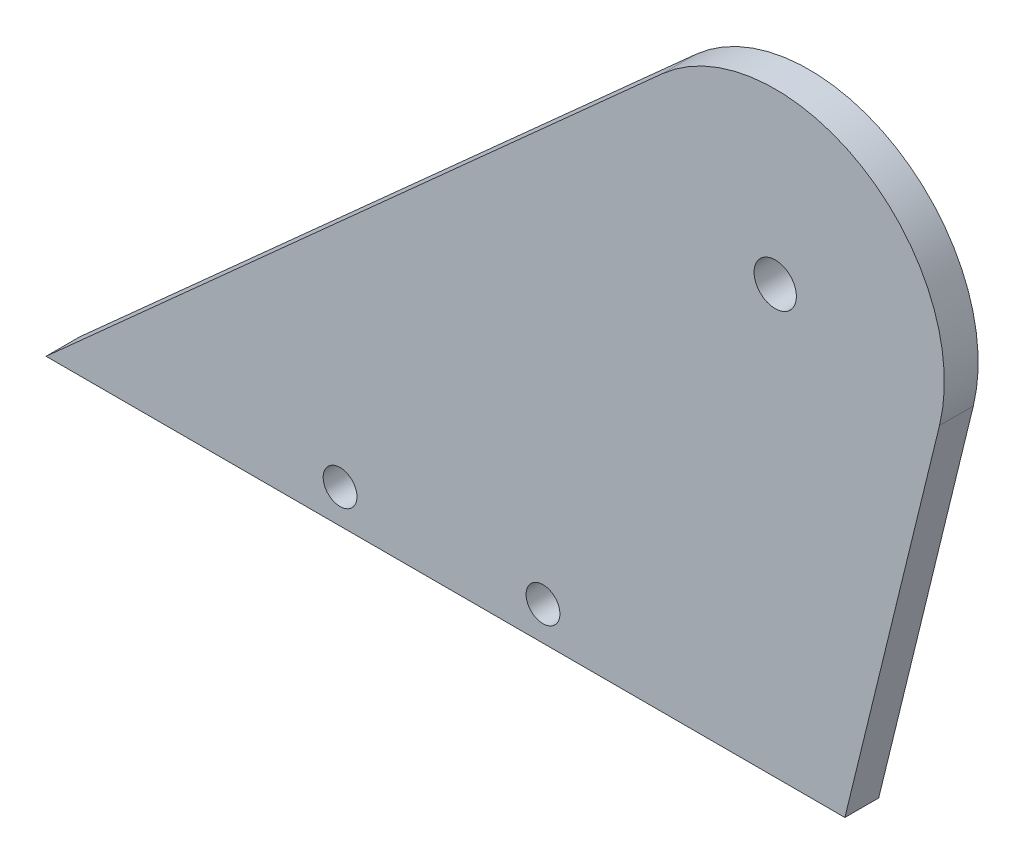
ISO-10303-21;
HEADER;
FILE_DESCRIPTION(('STEP AP214'),'2;1');
FILE_NAME('part.step','',(''),(''),'','','');
FILE_SCHEMA(('AUTOMOTIVE_DESIGN { 1 0 10303 214 1 1 1 1 }'));
ENDSEC;
DATA;
#1=APPLICATION_CONTEXT('core data for automotive mechanical design processes');
#2=APPLICATION_PROTOCOL_DEFINITION('international standard','automotive_design',2000,#1);
#3=PRODUCT_CONTEXT('',#1,'mechanical');
#4=PRODUCT('Part','Part','',(#3));
#5=PRODUCT_RELATED_PRODUCT_CATEGORY('part','',(#4));
#6=PRODUCT_DEFINITION_FORMATION('','',#4);
#7=PRODUCT_DEFINITION_CONTEXT('part definition',#1,'design');
#8=PRODUCT_DEFINITION('design','',#6,#7);
#9=PRODUCT_DEFINITION_SHAPE('','',#8);
#10=(LENGTH_UNIT() NAMED_UNIT(*) SI_UNIT(.MILLI.,.METRE.));
#11=(NAMED_UNIT(*) PLANE_ANGLE_UNIT() SI_UNIT($,.RADIAN.));
#12=(NAMED_UNIT(*) SI_UNIT($,.STERADIAN.) SOLID_ANGLE_UNIT());
#13=UNCERTAINTY_MEASURE_WITH_UNIT(LENGTH_MEASURE(1.E-05),#10,'distance_accuracy_value','');
#14=(GEOMETRIC_REPRESENTATION_CONTEXT(3) GLOBAL_UNCERTAINTY_ASSIGNED_CONTEXT((#13)) GLOBAL_UNIT_ASSIGNED_CONTEXT((#10,
#11,#12)) REPRESENTATION_CONTEXT('',''));
#15=CARTESIAN_POINT('',(0.,0.,0.));
#16=DIRECTION('',(0.,0.,1.));
#17=DIRECTION('',(1.,0.,0.));
#18=AXIS2_PLACEMENT_3D('',#15,#16,#17);
#19=CARTESIAN_POINT('',(0.,0.,2.));
#20=DIRECTION('',(0.,0.,1.));
#21=DIRECTION('',(1.,0.,0.));
#22=AXIS2_PLACEMENT_3D('',#19,#20,#21);
#23=PLANE('',#22);
#24=CARTESIAN_POINT('',(-25.7326094491656,-23.246867961275,2.));
#25=DIRECTION('',(0.,0.,1.));
#26=DIRECTION('',(1.,0.,0.));
#27=AXIS2_PLACEMENT_3D('',#24,#25,#26);
#28=CIRCLE('',#27,1.);
#29=CARTESIAN_POINT('',(-24.7326094491656,-23.246867961275,2.));
#30=VERTEX_POINT('',#29);
#31=EDGE_CURVE('E114',#30,#30,#28,.T.);
#32=ORIENTED_EDGE('',*,*,#31,.F.);
#33=EDGE_LOOP('',(#32));
#34=FACE_BOUND('',#33,.T.);
#35=CARTESIAN_POINT('',(0.,0.,2.));
#36=DIRECTION('',(0.,0.,1.));
#37=DIRECTION('',(1.,0.,0.));
#38=AXIS2_PLACEMENT_3D('',#35,#36,#37);
#39=CIRCLE('',#38,10.);
#40=CARTESIAN_POINT('',(9.71355394965933,-2.37631430308738,2.));
#41=VERTEX_POINT('',#40);
#42=CARTESIAN_POINT('',(-6.67743112180892,7.44391789405939,2.));
#43=VERTEX_POINT('',#42);
#44=EDGE_CURVE('E83',#41,#43,#39,.T.);
#45=ORIENTED_EDGE('',*,*,#44,.T.);
#46=DIRECTION('',(-0.744391789405939,-0.667743112180893,0.));
#47=VECTOR('',#46,1.);
#48=CARTESIAN_POINT('',(-43.1207161756372,-25.246867961275,2.));
#49=LINE('',#48,#47);
#50=CARTESIAN_POINT('',(-43.1207161756372,-25.246867961275,2.));
#51=VERTEX_POINT('',#50);
#52=EDGE_CURVE('E78',#43,#51,#49,.T.);
#53=ORIENTED_EDGE('',*,*,#52,.T.);
#54=DIRECTION('',(1.,0.,0.));
#55=VECTOR('',#54,1.);
#56=CARTESIAN_POINT('',(-43.1207161756372,-25.246867961275,2.));
#57=LINE('',#56,#55);
#58=CARTESIAN_POINT('',(4.11852415323917,-25.246867961275,2.));
#59=VERTEX_POINT('',#58);
#60=EDGE_CURVE('E81',#51,#59,#57,.T.);
#61=ORIENTED_EDGE('',*,*,#60,.T.);
#62=DIRECTION('',(0.237631430308738,0.971355394965933,0.));
#63=VECTOR('',#62,1.);
#64=CARTESIAN_POINT('',(4.11852415323917,-25.246867961275,2.));
#65=LINE('',#64,#63);
#66=EDGE_CURVE('E49',#59,#41,#65,.T.);
#67=ORIENTED_EDGE('',*,*,#66,.T.);
#68=EDGE_LOOP('',(#45,#53,#61,#67));
#69=FACE_BOUND('',#68,.T.);
#70=CARTESIAN_POINT('',(0.,0.,2.));
#71=DIRECTION('',(0.,0.,1.));
#72=DIRECTION('',(1.,0.,0.));
#73=AXIS2_PLACEMENT_3D('',#70,#71,#72);
#74=CIRCLE('',#73,1.25);
#75=CARTESIAN_POINT('',(1.25,0.,2.));
#76=VERTEX_POINT('',#75);
#77=EDGE_CURVE('E99',#76,#76,#74,.T.);
#78=ORIENTED_EDGE('',*,*,#77,.F.);
#79=EDGE_LOOP('',(#78));
#80=FACE_BOUND('',#79,.T.);
#81=CARTESIAN_POINT('',(-13.7326094491656,-23.246867961275,2.));
#82=DIRECTION('',(0.,0.,1.));
#83=DIRECTION('',(1.,0.,0.));
#84=AXIS2_PLACEMENT_3D('',#81,#82,#83);
#85=CIRCLE('',#84,1.);
#86=CARTESIAN_POINT('',(-12.7326094491656,-23.246867961275,2.));
#87=VERTEX_POINT('',#86);
#88=EDGE_CURVE('E120',#87,#87,#85,.T.);
#89=ORIENTED_EDGE('',*,*,#88,.F.);
#90=EDGE_LOOP('',(#89));
#91=FACE_BOUND('',#90,.T.);
#92=ADVANCED_FACE('F32',(#34,#69,#80,#91),#23,.T.);
#93=CARTESIAN_POINT('',(0.,0.,0.));
#94=DIRECTION('',(0.,0.,1.));
#95=DIRECTION('',(1.,0.,0.));
#96=AXIS2_PLACEMENT_3D('',#93,#94,#95);
#97=PLANE('',#96);
#98=CARTESIAN_POINT('',(0.,0.,0.));
#99=DIRECTION('',(0.,0.,1.));
#100=DIRECTION('',(1.,0.,0.));
#101=AXIS2_PLACEMENT_3D('',#98,#99,#100);
#102=CIRCLE('',#101,10.);
#103=CARTESIAN_POINT('',(9.71355394965933,-2.37631430308738,0.));
#104=VERTEX_POINT('',#103);
#105=CARTESIAN_POINT('',(-6.67743112180892,7.44391789405939,0.));
#106=VERTEX_POINT('',#105);
#107=EDGE_CURVE('E96',#104,#106,#102,.T.);
#108=ORIENTED_EDGE('',*,*,#107,.F.);
#109=DIRECTION('',(0.237631430308738,0.971355394965933,0.));
#110=VECTOR('',#109,1.);
#111=CARTESIAN_POINT('',(4.11852415323917,-25.246867961275,0.));
#112=LINE('',#111,#110);
#113=CARTESIAN_POINT('',(4.11852415323917,-25.246867961275,0.));
#114=VERTEX_POINT('',#113);
#115=EDGE_CURVE('E71',#114,#104,#112,.T.);
#116=ORIENTED_EDGE('',*,*,#115,.F.);
#117=DIRECTION('',(1.,0.,0.));
#118=VECTOR('',#117,1.);
#119=CARTESIAN_POINT('',(4.11852415323917,-25.246867961275,0.));
#120=LINE('',#119,#118);
#121=CARTESIAN_POINT('',(-43.1207161756372,-25.246867961275,0.));
#122=VERTEX_POINT('',#121);
#123=EDGE_CURVE('E65',#122,#114,#120,.T.);
#124=ORIENTED_EDGE('',*,*,#123,.F.);
#125=DIRECTION('',(-0.744391789405939,-0.667743112180893,0.));
#126=VECTOR('',#125,1.);
#127=CARTESIAN_POINT('',(-43.1207161756372,-25.246867961275,0.));
#128=LINE('',#127,#126);
#129=EDGE_CURVE('E88',#106,#122,#128,.T.);
#130=ORIENTED_EDGE('',*,*,#129,.F.);
#131=EDGE_LOOP('',(#108,#116,#124,#130));
#132=FACE_BOUND('',#131,.T.);
#133=CARTESIAN_POINT('',(0.,0.,0.));
#134=DIRECTION('',(0.,0.,1.));
#135=DIRECTION('',(1.,0.,0.));
#136=AXIS2_PLACEMENT_3D('',#133,#134,#135);
#137=CIRCLE('',#136,1.25);
#138=CARTESIAN_POINT('',(1.25,0.,0.));
#139=VERTEX_POINT('',#138);
#140=EDGE_CURVE('E111',#139,#139,#137,.T.);
#141=ORIENTED_EDGE('',*,*,#140,.T.);
#142=EDGE_LOOP('',(#141));
#143=FACE_BOUND('',#142,.T.);
#144=CARTESIAN_POINT('',(-25.7326094491656,-23.246867961275,0.));
#145=DIRECTION('',(0.,0.,1.));
#146=DIRECTION('',(1.,0.,0.));
#147=AXIS2_PLACEMENT_3D('',#144,#145,#146);
#148=CIRCLE('',#147,1.);
#149=CARTESIAN_POINT('',(-24.7326094491656,-23.246867961275,0.));
#150=VERTEX_POINT('',#149);
#151=EDGE_CURVE('E117',#150,#150,#148,.T.);
#152=ORIENTED_EDGE('',*,*,#151,.T.);
#153=EDGE_LOOP('',(#152));
#154=FACE_BOUND('',#153,.T.);
#155=CARTESIAN_POINT('',(-13.7326094491656,-23.246867961275,0.));
#156=DIRECTION('',(0.,0.,1.));
#157=DIRECTION('',(1.,0.,0.));
#158=AXIS2_PLACEMENT_3D('',#155,#156,#157);
#159=CIRCLE('',#158,1.);
#160=CARTESIAN_POINT('',(-12.7326094491656,-23.246867961275,0.));
#161=VERTEX_POINT('',#160);
#162=EDGE_CURVE('E123',#161,#161,#159,.T.);
#163=ORIENTED_EDGE('',*,*,#162,.T.);
#164=EDGE_LOOP('',(#163));
#165=FACE_BOUND('',#164,.T.);
#166=ADVANCED_FACE('F107',(#132,#143,#154,#165),#97,.F.);
#167=CARTESIAN_POINT('',(0.,0.,2.));
#168=DIRECTION('',(0.,0.,-1.));
#169=DIRECTION('',(-1.,0.,0.));
#170=AXIS2_PLACEMENT_3D('',#167,#168,#169);
#171=CYLINDRICAL_SURFACE('',#170,10.);
#172=ORIENTED_EDGE('',*,*,#107,.T.);
#173=DIRECTION('',(0.,0.,-1.));
#174=VECTOR('',#173,1.);
#175=CARTESIAN_POINT('',(-6.67743112180892,7.44391789405939,2.));
#176=LINE('',#175,#174);
#177=EDGE_CURVE('E11',#43,#106,#176,.T.);
#178=ORIENTED_EDGE('',*,*,#177,.F.);
#179=ORIENTED_EDGE('',*,*,#44,.F.);
#180=DIRECTION('',(0.,0.,-1.));
#181=VECTOR('',#180,1.);
#182=CARTESIAN_POINT('',(9.71355394965933,-2.37631430308738,2.));
#183=LINE('',#182,#181);
#184=EDGE_CURVE('E92',#41,#104,#183,.T.);
#185=ORIENTED_EDGE('',*,*,#184,.T.);
#186=EDGE_LOOP('',(#172,#178,#179,#185));
#187=FACE_BOUND('',#186,.T.);
#188=ADVANCED_FACE('F34',(#187),#171,.T.);
#189=CARTESIAN_POINT('',(-43.1207161756372,-25.246867961275,2.));
#190=DIRECTION('',(0.667743112180893,-0.744391789405939,0.));
#191=DIRECTION('',(0.744391789405939,0.667743112180893,0.));
#192=AXIS2_PLACEMENT_3D('',#189,#190,#191);
#193=PLANE('',#192);
#194=ORIENTED_EDGE('',*,*,#129,.T.);
#195=DIRECTION('',(0.,0.,-1.));
#196=VECTOR('',#195,1.);
#197=CARTESIAN_POINT('',(-43.1207161756372,-25.246867961275,2.));
#198=LINE('',#197,#196);
#199=EDGE_CURVE('E41',#51,#122,#198,.T.);
#200=ORIENTED_EDGE('',*,*,#199,.F.);
#201=ORIENTED_EDGE('',*,*,#52,.F.);
#202=ORIENTED_EDGE('',*,*,#177,.T.);
#203=EDGE_LOOP('',(#194,#200,#201,#202));
#204=FACE_BOUND('',#203,.T.);
#205=ADVANCED_FACE('F87',(#204),#193,.F.);
#206=CARTESIAN_POINT('',(4.11852415323917,-25.246867961275,2.));
#207=DIRECTION('',(0.,1.,0.));
#208=DIRECTION('',(0.,0.,1.));
#209=AXIS2_PLACEMENT_3D('',#206,#207,#208);
#210=PLANE('',#209);
#211=ORIENTED_EDGE('',*,*,#123,.T.);
#212=DIRECTION('',(0.,0.,-1.));
#213=VECTOR('',#212,1.);
#214=CARTESIAN_POINT('',(4.11852415323917,-25.246867961275,2.));
#215=LINE('',#214,#213);
#216=EDGE_CURVE('E89',#59,#114,#215,.T.);
#217=ORIENTED_EDGE('',*,*,#216,.F.);
#218=ORIENTED_EDGE('',*,*,#60,.F.);
#219=ORIENTED_EDGE('',*,*,#199,.T.);
#220=EDGE_LOOP('',(#211,#217,#218,#219));
#221=FACE_BOUND('',#220,.T.);
#222=ADVANCED_FACE('F90',(#221),#210,.F.);
#223=CARTESIAN_POINT('',(4.11852415323917,-25.246867961275,2.));
#224=DIRECTION('',(-0.971355394965933,0.237631430308738,0.));
#225=DIRECTION('',(-0.237631430308738,-0.971355394965933,0.));
#226=AXIS2_PLACEMENT_3D('',#223,#224,#225);
#227=PLANE('',#226);
#228=ORIENTED_EDGE('',*,*,#115,.T.);
#229=ORIENTED_EDGE('',*,*,#184,.F.);
#230=ORIENTED_EDGE('',*,*,#66,.F.);
#231=ORIENTED_EDGE('',*,*,#216,.T.);
#232=EDGE_LOOP('',(#228,#229,#230,#231));
#233=FACE_BOUND('',#232,.T.);
#234=ADVANCED_FACE('F104',(#233),#227,.F.);
#235=CARTESIAN_POINT('',(0.,0.,2.));
#236=DIRECTION('',(0.,0.,-1.));
#237=DIRECTION('',(-1.,0.,0.));
#238=AXIS2_PLACEMENT_3D('',#235,#236,#237);
#239=CYLINDRICAL_SURFACE('',#238,1.25);
#240=ORIENTED_EDGE('',*,*,#77,.T.);
#241=EDGE_LOOP('',(#240));
#242=FACE_BOUND('',#241,.T.);
#243=ORIENTED_EDGE('',*,*,#140,.F.);
#244=EDGE_LOOP('',(#243));
#245=FACE_BOUND('',#244,.T.);
#246=ADVANCED_FACE('F141',(#242,#245),#239,.F.);
#247=CARTESIAN_POINT('',(-25.7326094491656,-23.246867961275,2.));
#248=DIRECTION('',(0.,0.,-1.));
#249=DIRECTION('',(-1.,0.,0.));
#250=AXIS2_PLACEMENT_3D('',#247,#248,#249);
#251=CYLINDRICAL_SURFACE('',#250,1.);
#252=ORIENTED_EDGE('',*,*,#31,.T.);
#253=EDGE_LOOP('',(#252));
#254=FACE_BOUND('',#253,.T.);
#255=ORIENTED_EDGE('',*,*,#151,.F.);
#256=EDGE_LOOP('',(#255));
#257=FACE_BOUND('',#256,.T.);
#258=ADVANCED_FACE('F193',(#254,#257),#251,.F.);
#259=CARTESIAN_POINT('',(-13.7326094491656,-23.246867961275,2.));
#260=DIRECTION('',(0.,0.,-1.));
#261=DIRECTION('',(-1.,0.,0.));
#262=AXIS2_PLACEMENT_3D('',#259,#260,#261);
#263=CYLINDRICAL_SURFACE('',#262,1.);
#264=ORIENTED_EDGE('',*,*,#88,.T.);
#265=EDGE_LOOP('',(#264));
#266=FACE_BOUND('',#265,.T.);
#267=ORIENTED_EDGE('',*,*,#162,.F.);
#268=EDGE_LOOP('',(#267));
#269=FACE_BOUND('',#268,.T.);
#270=ADVANCED_FACE('F129',(#266,#269),#263,.F.);
#271=CLOSED_SHELL('',(#92,#166,#188,#205,#222,#234,#246,#258,#270));
#272=MANIFOLD_SOLID_BREP('B2',#271);
#273=ADVANCED_BREP_SHAPE_REPRESENTATION('',(#18,#272),#14);
#274=SHAPE_DEFINITION_REPRESENTATION(#9,#273);
ENDSEC;
END-ISO-10303-21;
